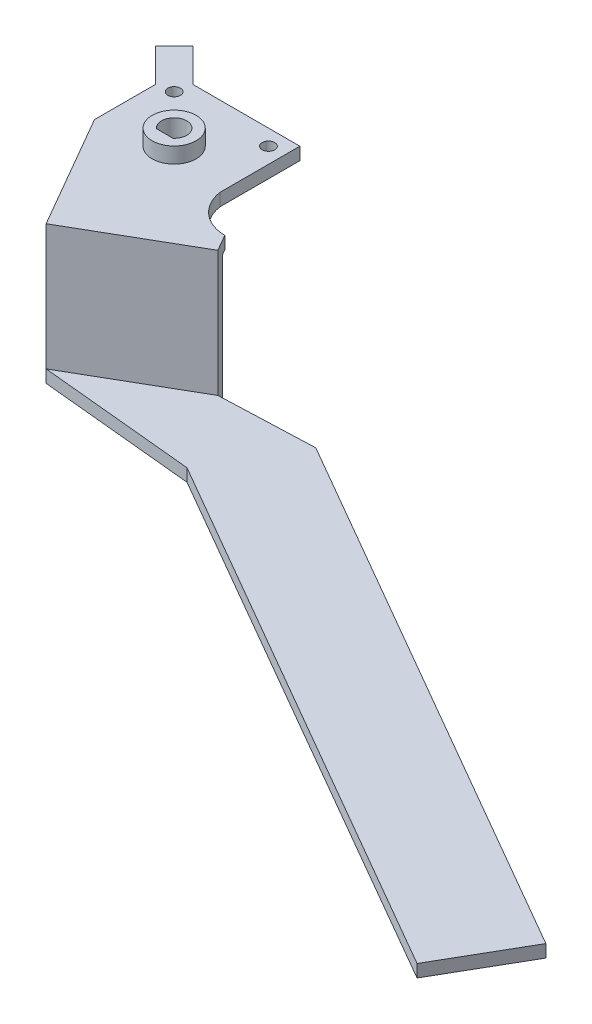
ISO-10303-21;
HEADER;
FILE_DESCRIPTION(('STEP AP214'),'2;1');
FILE_NAME('part.step','',(''),(''),'','','');
FILE_SCHEMA(('AUTOMOTIVE_DESIGN { 1 0 10303 214 1 1 1 1 }'));
ENDSEC;
DATA;
#1=APPLICATION_CONTEXT('core data for automotive mechanical design processes');
#2=APPLICATION_PROTOCOL_DEFINITION('international standard','automotive_design',2000,#1);
#3=PRODUCT_CONTEXT('',#1,'mechanical');
#4=PRODUCT('Part','Part','',(#3));
#5=PRODUCT_RELATED_PRODUCT_CATEGORY('part','',(#4));
#6=PRODUCT_DEFINITION_FORMATION('','',#4);
#7=PRODUCT_DEFINITION_CONTEXT('part definition',#1,'design');
#8=PRODUCT_DEFINITION('design','',#6,#7);
#9=PRODUCT_DEFINITION_SHAPE('','',#8);
#10=(LENGTH_UNIT() NAMED_UNIT(*) SI_UNIT(.MILLI.,.METRE.));
#11=(NAMED_UNIT(*) PLANE_ANGLE_UNIT() SI_UNIT($,.RADIAN.));
#12=(NAMED_UNIT(*) SI_UNIT($,.STERADIAN.) SOLID_ANGLE_UNIT());
#13=UNCERTAINTY_MEASURE_WITH_UNIT(LENGTH_MEASURE(1.E-05),#10,'distance_accuracy_value','');
#14=(GEOMETRIC_REPRESENTATION_CONTEXT(3) GLOBAL_UNCERTAINTY_ASSIGNED_CONTEXT((#13)) GLOBAL_UNIT_ASSIGNED_CONTEXT((#10,
#11,#12)) REPRESENTATION_CONTEXT('',''));
#15=CARTESIAN_POINT('',(0.,0.,0.));
#16=DIRECTION('',(0.,0.,1.));
#17=DIRECTION('',(1.,0.,0.));
#18=AXIS2_PLACEMENT_3D('',#15,#16,#17);
#19=CARTESIAN_POINT('',(32.8718229662952,0.,3.53794746118881));
#20=DIRECTION('',(0.,1.,0.));
#21=DIRECTION('',(0.,0.,1.));
#22=AXIS2_PLACEMENT_3D('',#19,#20,#21);
#23=PLANE('',#22);
#24=CARTESIAN_POINT('',(0.,0.,0.));
#25=DIRECTION('',(0.,1.,0.));
#26=DIRECTION('',(0.,0.,-1.));
#27=AXIS2_PLACEMENT_3D('',#24,#25,#26);
#28=CIRCLE('',#27,4.);
#29=CARTESIAN_POINT('',(2.64575131106459,0.,3.));
#30=VERTEX_POINT('',#29);
#31=CARTESIAN_POINT('',(-2.64575131106459,0.,3.));
#32=VERTEX_POINT('',#31);
#33=EDGE_CURVE('E55',#30,#32,#28,.T.);
#34=ORIENTED_EDGE('',*,*,#33,.T.);
#35=DIRECTION('',(1.,0.,0.));
#36=VECTOR('',#35,1.);
#37=CARTESIAN_POINT('',(-2.64575131106459,0.,3.));
#38=LINE('',#37,#36);
#39=EDGE_CURVE('E243',#32,#30,#38,.T.);
#40=ORIENTED_EDGE('',*,*,#39,.T.);
#41=EDGE_LOOP('',(#34,#40));
#42=FACE_BOUND('',#41,.T.);
#43=CARTESIAN_POINT('',(-15.,0.,-15.));
#44=DIRECTION('',(0.,1.,0.));
#45=DIRECTION('',(0.,0.,1.));
#46=AXIS2_PLACEMENT_3D('',#43,#44,#45);
#47=CIRCLE('',#46,2.);
#48=CARTESIAN_POINT('',(-15.,0.,-13.));
#49=VERTEX_POINT('',#48);
#50=EDGE_CURVE('E254',#49,#49,#47,.T.);
#51=ORIENTED_EDGE('',*,*,#50,.T.);
#52=EDGE_LOOP('',(#51));
#53=FACE_BOUND('',#52,.T.);
#54=CARTESIAN_POINT('',(15.,0.,-15.));
#55=DIRECTION('',(0.,1.,0.));
#56=DIRECTION('',(0.,0.,1.));
#57=AXIS2_PLACEMENT_3D('',#54,#55,#56);
#58=CIRCLE('',#57,2.00000000000001);
#59=CARTESIAN_POINT('',(15.,0.,-13.));
#60=VERTEX_POINT('',#59);
#61=EDGE_CURVE('E250',#60,#60,#58,.T.);
#62=ORIENTED_EDGE('',*,*,#61,.T.);
#63=EDGE_LOOP('',(#62));
#64=FACE_BOUND('',#63,.T.);
#65=DIRECTION('',(0.866025403784439,0.,-0.5));
#66=VECTOR('',#65,1.);
#67=CARTESIAN_POINT('',(33.6410161513782,0.,18.2679491924316));
#68=LINE('',#67,#66);
#69=CARTESIAN_POINT('',(-0.999999999999408,0.,38.2679491924316));
#70=VERTEX_POINT('',#69);
#71=CARTESIAN_POINT('',(33.6410161513782,0.,18.2679491924316));
#72=VERTEX_POINT('',#71);
#73=EDGE_CURVE('E47',#70,#72,#68,.T.);
#74=ORIENTED_EDGE('',*,*,#73,.F.);
#75=DIRECTION('',(0.500000000000005,0.,0.866025403784435));
#76=VECTOR('',#75,1.);
#77=CARTESIAN_POINT('',(0.99999999999973,0.,41.7320508075678));
#78=LINE('',#77,#76);
#79=CARTESIAN_POINT('',(-20.0000000000002,0.,5.35898384862204));
#80=VERTEX_POINT('',#79);
#81=EDGE_CURVE('E296',#80,#70,#78,.T.);
#82=ORIENTED_EDGE('',*,*,#81,.F.);
#83=DIRECTION('',(0.,0.,1.));
#84=VECTOR('',#83,1.);
#85=CARTESIAN_POINT('',(-20.,0.,-14.));
#86=LINE('',#85,#84);
#87=CARTESIAN_POINT('',(-20.,0.,-14.));
#88=VERTEX_POINT('',#87);
#89=EDGE_CURVE('E294',#88,#80,#86,.T.);
#90=ORIENTED_EDGE('',*,*,#89,.F.);
#91=DIRECTION('',(0.707106781186547,0.,0.707106781186547));
#92=VECTOR('',#91,1.);
#93=CARTESIAN_POINT('',(-30.6066017177982,0.,-24.6066017177982));
#94=LINE('',#93,#92);
#95=CARTESIAN_POINT('',(-30.6066017177982,0.,-24.6066017177982));
#96=VERTEX_POINT('',#95);
#97=EDGE_CURVE('E292',#96,#88,#94,.T.);
#98=ORIENTED_EDGE('',*,*,#97,.F.);
#99=DIRECTION('',(-0.707106781186548,0.,0.707106781186547));
#100=VECTOR('',#99,1.);
#101=CARTESIAN_POINT('',(-24.6066017177982,0.,-30.6066017177982));
#102=LINE('',#101,#100);
#103=CARTESIAN_POINT('',(-24.6066017177982,0.,-30.6066017177982));
#104=VERTEX_POINT('',#103);
#105=EDGE_CURVE('E290',#104,#96,#102,.T.);
#106=ORIENTED_EDGE('',*,*,#105,.F.);
#107=DIRECTION('',(-0.707106781186548,0.,-0.707106781186547));
#108=VECTOR('',#107,1.);
#109=CARTESIAN_POINT('',(-14.,0.,-20.));
#110=LINE('',#109,#108);
#111=CARTESIAN_POINT('',(-14.,0.,-20.));
#112=VERTEX_POINT('',#111);
#113=EDGE_CURVE('E288',#112,#104,#110,.T.);
#114=ORIENTED_EDGE('',*,*,#113,.F.);
#115=DIRECTION('',(-1.,0.,0.));
#116=VECTOR('',#115,1.);
#117=CARTESIAN_POINT('',(-14.,0.,-20.));
#118=LINE('',#117,#116);
#119=CARTESIAN_POINT('',(20.,0.,-20.));
#120=VERTEX_POINT('',#119);
#121=EDGE_CURVE('E260',#120,#112,#118,.T.);
#122=ORIENTED_EDGE('',*,*,#121,.F.);
#123=DIRECTION('',(0.,0.,-1.));
#124=VECTOR('',#123,1.);
#125=CARTESIAN_POINT('',(20.,0.,-20.));
#126=LINE('',#125,#124);
#127=CARTESIAN_POINT('',(20.,0.,5.35898384862204));
#128=VERTEX_POINT('',#127);
#129=EDGE_CURVE('E267',#128,#120,#126,.T.);
#130=ORIENTED_EDGE('',*,*,#129,.F.);
#131=CARTESIAN_POINT('',(32.8718229662952,0.,3.53794746118881));
#132=DIRECTION('',(0.,-1.,0.));
#133=DIRECTION('',(0.,0.,1.));
#134=AXIS2_PLACEMENT_3D('',#131,#132,#133);
#135=CIRCLE('',#134,13.);
#136=CARTESIAN_POINT('',(32.6410161513771,0.,16.5358983848609));
#137=VERTEX_POINT('',#136);
#138=EDGE_CURVE('E300',#137,#128,#135,.T.);
#139=ORIENTED_EDGE('',*,*,#138,.F.);
#140=DIRECTION('',(-0.500000000000001,0.,-0.866025403784438));
#141=VECTOR('',#140,1.);
#142=CARTESIAN_POINT('',(35.6410161513771,0.,21.7320508075675));
#143=LINE('',#142,#141);
#144=EDGE_CURVE('E298',#72,#137,#143,.T.);
#145=ORIENTED_EDGE('',*,*,#144,.F.);
#146=EDGE_LOOP('',(#74,#82,#90,#98,#106,#114,#122,#130,#139,#145));
#147=FACE_BOUND('',#146,.T.);
#148=ADVANCED_FACE('F32',(#42,#53,#64,#147),#23,.F.);
#149=CARTESIAN_POINT('',(32.8718229662952,4.,3.53794746118881));
#150=DIRECTION('',(0.,1.,0.));
#151=DIRECTION('',(0.,0.,1.));
#152=AXIS2_PLACEMENT_3D('',#149,#150,#151);
#153=PLANE('',#152);
#154=CARTESIAN_POINT('',(15.,4.,-15.));
#155=DIRECTION('',(0.,1.,0.));
#156=DIRECTION('',(0.,0.,1.));
#157=AXIS2_PLACEMENT_3D('',#154,#155,#156);
#158=CIRCLE('',#157,2.00000000000001);
#159=CARTESIAN_POINT('',(15.,4.,-13.));
#160=VERTEX_POINT('',#159);
#161=EDGE_CURVE('E251',#160,#160,#158,.T.);
#162=ORIENTED_EDGE('',*,*,#161,.F.);
#163=EDGE_LOOP('',(#162));
#164=FACE_BOUND('',#163,.T.);
#165=DIRECTION('',(-1.,0.,0.));
#166=VECTOR('',#165,1.);
#167=CARTESIAN_POINT('',(-14.,4.,-20.));
#168=LINE('',#167,#166);
#169=CARTESIAN_POINT('',(20.,4.,-20.));
#170=VERTEX_POINT('',#169);
#171=CARTESIAN_POINT('',(-14.,4.,-20.));
#172=VERTEX_POINT('',#171);
#173=EDGE_CURVE('E263',#170,#172,#168,.T.);
#174=ORIENTED_EDGE('',*,*,#173,.T.);
#175=DIRECTION('',(-0.707106781186548,0.,-0.707106781186547));
#176=VECTOR('',#175,1.);
#177=CARTESIAN_POINT('',(-14.,4.,-20.));
#178=LINE('',#177,#176);
#179=CARTESIAN_POINT('',(-24.6066017177982,4.,-30.6066017177982));
#180=VERTEX_POINT('',#179);
#181=EDGE_CURVE('E266',#172,#180,#178,.T.);
#182=ORIENTED_EDGE('',*,*,#181,.T.);
#183=DIRECTION('',(-0.707106781186548,0.,0.707106781186547));
#184=VECTOR('',#183,1.);
#185=CARTESIAN_POINT('',(-24.6066017177982,4.,-30.6066017177982));
#186=LINE('',#185,#184);
#187=CARTESIAN_POINT('',(-30.6066017177982,4.,-24.6066017177982));
#188=VERTEX_POINT('',#187);
#189=EDGE_CURVE('E269',#180,#188,#186,.T.);
#190=ORIENTED_EDGE('',*,*,#189,.T.);
#191=DIRECTION('',(0.707106781186547,0.,0.707106781186547));
#192=VECTOR('',#191,1.);
#193=CARTESIAN_POINT('',(-30.6066017177982,4.,-24.6066017177982));
#194=LINE('',#193,#192);
#195=CARTESIAN_POINT('',(-20.,4.,-14.));
#196=VERTEX_POINT('',#195);
#197=EDGE_CURVE('E271',#188,#196,#194,.T.);
#198=ORIENTED_EDGE('',*,*,#197,.T.);
#199=DIRECTION('',(0.,0.,1.));
#200=VECTOR('',#199,1.);
#201=CARTESIAN_POINT('',(-20.,4.,-14.));
#202=LINE('',#201,#200);
#203=CARTESIAN_POINT('',(-20.0000000000002,4.,5.35898384862204));
#204=VERTEX_POINT('',#203);
#205=EDGE_CURVE('E273',#196,#204,#202,.T.);
#206=ORIENTED_EDGE('',*,*,#205,.T.);
#207=DIRECTION('',(0.500000000000005,0.,0.866025403784435));
#208=VECTOR('',#207,1.);
#209=CARTESIAN_POINT('',(0.99999999999973,4.,41.7320508075678));
#210=LINE('',#209,#208);
#211=CARTESIAN_POINT('',(0.99999999999973,4.,41.7320508075678));
#212=VERTEX_POINT('',#211);
#213=EDGE_CURVE('E275',#204,#212,#210,.T.);
#214=ORIENTED_EDGE('',*,*,#213,.T.);
#215=DIRECTION('',(0.866025403784434,0.,-0.500000000000007));
#216=VECTOR('',#215,1.);
#217=CARTESIAN_POINT('',(0.99999999999973,4.,41.7320508075678));
#218=LINE('',#217,#216);
#219=CARTESIAN_POINT('',(35.6410161513771,4.,21.7320508075675));
#220=VERTEX_POINT('',#219);
#221=EDGE_CURVE('E277',#212,#220,#218,.T.);
#222=ORIENTED_EDGE('',*,*,#221,.T.);
#223=DIRECTION('',(-0.500000000000001,0.,-0.866025403784438));
#224=VECTOR('',#223,1.);
#225=CARTESIAN_POINT('',(35.6410161513771,4.,21.7320508075675));
#226=LINE('',#225,#224);
#227=CARTESIAN_POINT('',(32.6410161513771,4.,16.5358983848609));
#228=VERTEX_POINT('',#227);
#229=EDGE_CURVE('E279',#220,#228,#226,.T.);
#230=ORIENTED_EDGE('',*,*,#229,.T.);
#231=CARTESIAN_POINT('',(32.8718229662952,4.,3.53794746118881));
#232=DIRECTION('',(0.,-1.,0.));
#233=DIRECTION('',(0.,0.,1.));
#234=AXIS2_PLACEMENT_3D('',#231,#232,#233);
#235=CIRCLE('',#234,13.);
#236=CARTESIAN_POINT('',(20.,4.,5.35898384862204));
#237=VERTEX_POINT('',#236);
#238=EDGE_CURVE('E281',#228,#237,#235,.T.);
#239=ORIENTED_EDGE('',*,*,#238,.T.);
#240=DIRECTION('',(0.,0.,-1.));
#241=VECTOR('',#240,1.);
#242=CARTESIAN_POINT('',(20.,4.,-20.));
#243=LINE('',#242,#241);
#244=EDGE_CURVE('E283',#237,#170,#243,.T.);
#245=ORIENTED_EDGE('',*,*,#244,.T.);
#246=EDGE_LOOP('',(#174,#182,#190,#198,#206,#214,#222,#230,#239,#245));
#247=FACE_BOUND('',#246,.T.);
#248=CARTESIAN_POINT('',(-15.,4.,-15.));
#249=DIRECTION('',(0.,1.,0.));
#250=DIRECTION('',(0.,0.,1.));
#251=AXIS2_PLACEMENT_3D('',#248,#249,#250);
#252=CIRCLE('',#251,2.);
#253=CARTESIAN_POINT('',(-15.,4.,-13.));
#254=VERTEX_POINT('',#253);
#255=EDGE_CURVE('E257',#254,#254,#252,.T.);
#256=ORIENTED_EDGE('',*,*,#255,.F.);
#257=EDGE_LOOP('',(#256));
#258=FACE_BOUND('',#257,.T.);
#259=CARTESIAN_POINT('',(0.,4.,0.));
#260=DIRECTION('',(0.,1.,0.));
#261=DIRECTION('',(0.,0.,1.));
#262=AXIS2_PLACEMENT_3D('',#259,#260,#261);
#263=CIRCLE('',#262,7.);
#264=CARTESIAN_POINT('',(0.,4.,7.));
#265=VERTEX_POINT('',#264);
#266=EDGE_CURVE('E236',#265,#265,#263,.T.);
#267=ORIENTED_EDGE('',*,*,#266,.F.);
#268=EDGE_LOOP('',(#267));
#269=FACE_BOUND('',#268,.T.);
#270=ADVANCED_FACE('F346',(#164,#247,#258,#269),#153,.T.);
#271=CARTESIAN_POINT('',(-14.,4.,-20.));
#272=DIRECTION('',(0.,0.,1.));
#273=DIRECTION('',(1.,0.,0.));
#274=AXIS2_PLACEMENT_3D('',#271,#272,#273);
#275=PLANE('',#274);
#276=ORIENTED_EDGE('',*,*,#121,.T.);
#277=DIRECTION('',(0.,-1.,0.));
#278=VECTOR('',#277,1.);
#279=CARTESIAN_POINT('',(-14.,4.,-20.));
#280=LINE('',#279,#278);
#281=EDGE_CURVE('E11',#172,#112,#280,.T.);
#282=ORIENTED_EDGE('',*,*,#281,.F.);
#283=ORIENTED_EDGE('',*,*,#173,.F.);
#284=DIRECTION('',(0.,-1.,0.));
#285=VECTOR('',#284,1.);
#286=CARTESIAN_POINT('',(20.,4.,-20.));
#287=LINE('',#286,#285);
#288=EDGE_CURVE('E285',#170,#120,#287,.T.);
#289=ORIENTED_EDGE('',*,*,#288,.T.);
#290=EDGE_LOOP('',(#276,#282,#283,#289));
#291=FACE_BOUND('',#290,.T.);
#292=ADVANCED_FACE('F34',(#291),#275,.F.);
#293=CARTESIAN_POINT('',(-14.,4.,-20.));
#294=DIRECTION('',(-0.707106781186547,0.,0.707106781186548));
#295=DIRECTION('',(0.707106781186548,0.,0.707106781186547));
#296=AXIS2_PLACEMENT_3D('',#293,#294,#295);
#297=PLANE('',#296);
#298=ORIENTED_EDGE('',*,*,#113,.T.);
#299=DIRECTION('',(0.,-1.,0.));
#300=VECTOR('',#299,1.);
#301=CARTESIAN_POINT('',(-24.6066017177982,4.,-30.6066017177982));
#302=LINE('',#301,#300);
#303=EDGE_CURVE('E40',#180,#104,#302,.T.);
#304=ORIENTED_EDGE('',*,*,#303,.F.);
#305=ORIENTED_EDGE('',*,*,#181,.F.);
#306=ORIENTED_EDGE('',*,*,#281,.T.);
#307=EDGE_LOOP('',(#298,#304,#305,#306));
#308=FACE_BOUND('',#307,.T.);
#309=ADVANCED_FACE('F351',(#308),#297,.F.);
#310=CARTESIAN_POINT('',(-24.6066017177982,4.,-30.6066017177982));
#311=DIRECTION('',(0.707106781186547,0.,0.707106781186548));
#312=DIRECTION('',(0.707106781186548,0.,-0.707106781186547));
#313=AXIS2_PLACEMENT_3D('',#310,#311,#312);
#314=PLANE('',#313);
#315=ORIENTED_EDGE('',*,*,#105,.T.);
#316=DIRECTION('',(0.,-1.,0.));
#317=VECTOR('',#316,1.);
#318=CARTESIAN_POINT('',(-30.6066017177982,4.,-24.6066017177982));
#319=LINE('',#318,#317);
#320=EDGE_CURVE('E323',#188,#96,#319,.T.);
#321=ORIENTED_EDGE('',*,*,#320,.F.);
#322=ORIENTED_EDGE('',*,*,#189,.F.);
#323=ORIENTED_EDGE('',*,*,#303,.T.);
#324=EDGE_LOOP('',(#315,#321,#322,#323));
#325=FACE_BOUND('',#324,.T.);
#326=ADVANCED_FACE('F330',(#325),#314,.F.);
#327=CARTESIAN_POINT('',(-30.6066017177982,4.,-24.6066017177982));
#328=DIRECTION('',(0.707106781186548,0.,-0.707106781186548));
#329=DIRECTION('',(-0.707106781186547,0.,-0.707106781186548));
#330=AXIS2_PLACEMENT_3D('',#327,#328,#329);
#331=PLANE('',#330);
#332=ORIENTED_EDGE('',*,*,#97,.T.);
#333=DIRECTION('',(0.,-1.,0.));
#334=VECTOR('',#333,1.);
#335=CARTESIAN_POINT('',(-20.,4.,-14.));
#336=LINE('',#335,#334);
#337=EDGE_CURVE('E320',#196,#88,#336,.T.);
#338=ORIENTED_EDGE('',*,*,#337,.F.);
#339=ORIENTED_EDGE('',*,*,#197,.F.);
#340=ORIENTED_EDGE('',*,*,#320,.T.);
#341=EDGE_LOOP('',(#332,#338,#339,#340));
#342=FACE_BOUND('',#341,.T.);
#343=ADVANCED_FACE('F338',(#342),#331,.F.);
#344=CARTESIAN_POINT('',(-20.,4.,-14.));
#345=DIRECTION('',(1.,0.,0.));
#346=DIRECTION('',(0.,0.,-1.));
#347=AXIS2_PLACEMENT_3D('',#344,#345,#346);
#348=PLANE('',#347);
#349=ORIENTED_EDGE('',*,*,#89,.T.);
#350=DIRECTION('',(0.,-1.,0.));
#351=VECTOR('',#350,1.);
#352=CARTESIAN_POINT('',(-20.0000000000002,4.,5.35898384862204));
#353=LINE('',#352,#351);
#354=EDGE_CURVE('E317',#204,#80,#353,.T.);
#355=ORIENTED_EDGE('',*,*,#354,.F.);
#356=ORIENTED_EDGE('',*,*,#205,.F.);
#357=ORIENTED_EDGE('',*,*,#337,.T.);
#358=EDGE_LOOP('',(#349,#355,#356,#357));
#359=FACE_BOUND('',#358,.T.);
#360=ADVANCED_FACE('F342',(#359),#348,.F.);
#361=CARTESIAN_POINT('',(0.99999999999973,4.,41.7320508075678));
#362=DIRECTION('',(0.866025403784436,0.,-0.500000000000005));
#363=DIRECTION('',(-0.500000000000005,0.,-0.866025403784436));
#364=AXIS2_PLACEMENT_3D('',#361,#362,#363);
#365=PLANE('',#364);
#366=ORIENTED_EDGE('',*,*,#81,.T.);
#367=DIRECTION('',(0.,1.,0.));
#368=VECTOR('',#367,1.);
#369=CARTESIAN_POINT('',(-0.999999999999397,-40.,38.2679491924316));
#370=LINE('',#369,#368);
#371=CARTESIAN_POINT('',(-0.999999999999397,-40.,38.2679491924316));
#372=VERTEX_POINT('',#371);
#373=EDGE_CURVE('E227',#372,#70,#370,.T.);
#374=ORIENTED_EDGE('',*,*,#373,.F.);
#375=DIRECTION('',(-0.500000000000002,0.,-0.866025403784437));
#376=VECTOR('',#375,1.);
#377=CARTESIAN_POINT('',(-0.999999999999397,-40.,38.2679491924316));
#378=LINE('',#377,#376);
#379=CARTESIAN_POINT('',(1.00000000000078,-40.,41.7320508075696));
#380=VERTEX_POINT('',#379);
#381=EDGE_CURVE('E216',#380,#372,#378,.T.);
#382=ORIENTED_EDGE('',*,*,#381,.F.);
#383=DIRECTION('',(0.,-1.,0.));
#384=VECTOR('',#383,1.);
#385=CARTESIAN_POINT('',(0.99999999999973,-36.,41.7320508075678));
#386=LINE('',#385,#384);
#387=CARTESIAN_POINT('',(0.99999999999973,-36.,41.7320508075678));
#388=VERTEX_POINT('',#387);
#389=EDGE_CURVE('E208',#388,#380,#386,.T.);
#390=ORIENTED_EDGE('',*,*,#389,.F.);
#391=DIRECTION('',(0.,-1.,0.));
#392=VECTOR('',#391,1.);
#393=CARTESIAN_POINT('',(0.99999999999973,4.,41.7320508075678));
#394=LINE('',#393,#392);
#395=EDGE_CURVE('E314',#212,#388,#394,.T.);
#396=ORIENTED_EDGE('',*,*,#395,.F.);
#397=ORIENTED_EDGE('',*,*,#213,.F.);
#398=ORIENTED_EDGE('',*,*,#354,.T.);
#399=EDGE_LOOP('',(#366,#374,#382,#390,#396,#397,#398));
#400=FACE_BOUND('',#399,.T.);
#401=ADVANCED_FACE('F374',(#400),#365,.F.);
#402=CARTESIAN_POINT('',(0.99999999999973,4.,41.7320508075678));
#403=DIRECTION('',(-0.500000000000007,0.,-0.866025403784434));
#404=DIRECTION('',(-0.866025403784434,0.,0.500000000000007));
#405=AXIS2_PLACEMENT_3D('',#402,#403,#404);
#406=PLANE('',#405);
#407=ORIENTED_EDGE('',*,*,#395,.T.);
#408=DIRECTION('',(0.866025403784434,0.,-0.500000000000007));
#409=VECTOR('',#408,1.);
#410=CARTESIAN_POINT('',(0.99999999999973,-36.,41.7320508075678));
#411=LINE('',#410,#409);
#412=CARTESIAN_POINT('',(35.6410161513771,-36.,21.7320508075675));
#413=VERTEX_POINT('',#412);
#414=EDGE_CURVE('E198',#388,#413,#411,.T.);
#415=ORIENTED_EDGE('',*,*,#414,.T.);
#416=DIRECTION('',(0.,-1.,0.));
#417=VECTOR('',#416,1.);
#418=CARTESIAN_POINT('',(35.6410161513771,4.,21.7320508075675));
#419=LINE('',#418,#417);
#420=EDGE_CURVE('E311',#220,#413,#419,.T.);
#421=ORIENTED_EDGE('',*,*,#420,.F.);
#422=ORIENTED_EDGE('',*,*,#221,.F.);
#423=EDGE_LOOP('',(#407,#415,#421,#422));
#424=FACE_BOUND('',#423,.T.);
#425=ADVANCED_FACE('F379',(#424),#406,.F.);
#426=CARTESIAN_POINT('',(35.6410161513771,4.,21.7320508075675));
#427=DIRECTION('',(-0.866025403784438,0.,0.500000000000001));
#428=DIRECTION('',(0.500000000000001,0.,0.866025403784438));
#429=AXIS2_PLACEMENT_3D('',#426,#427,#428);
#430=PLANE('',#429);
#431=ORIENTED_EDGE('',*,*,#420,.T.);
#432=DIRECTION('',(0.,-1.,0.));
#433=VECTOR('',#432,1.);
#434=CARTESIAN_POINT('',(35.6410161513771,-36.,21.7320508075675));
#435=LINE('',#434,#433);
#436=CARTESIAN_POINT('',(35.6410161513771,-40.,21.7320508075675));
#437=VERTEX_POINT('',#436);
#438=EDGE_CURVE('E205',#413,#437,#435,.T.);
#439=ORIENTED_EDGE('',*,*,#438,.T.);
#440=DIRECTION('',(0.500000000000002,0.,0.866025403784437));
#441=VECTOR('',#440,1.);
#442=CARTESIAN_POINT('',(35.6410161513782,-40.,21.7320508075693));
#443=LINE('',#442,#441);
#444=CARTESIAN_POINT('',(33.6410161513782,-40.,18.2679491924316));
#445=VERTEX_POINT('',#444);
#446=EDGE_CURVE('E220',#445,#437,#443,.T.);
#447=ORIENTED_EDGE('',*,*,#446,.F.);
#448=DIRECTION('',(0.,1.,0.));
#449=VECTOR('',#448,1.);
#450=CARTESIAN_POINT('',(33.6410161513782,-40.,18.2679491924316));
#451=LINE('',#450,#449);
#452=EDGE_CURVE('E223',#445,#72,#451,.T.);
#453=ORIENTED_EDGE('',*,*,#452,.T.);
#454=ORIENTED_EDGE('',*,*,#144,.T.);
#455=DIRECTION('',(0.,-1.,0.));
#456=VECTOR('',#455,1.);
#457=CARTESIAN_POINT('',(32.6410161513771,4.,16.5358983848609));
#458=LINE('',#457,#456);
#459=EDGE_CURVE('E308',#228,#137,#458,.T.);
#460=ORIENTED_EDGE('',*,*,#459,.F.);
#461=ORIENTED_EDGE('',*,*,#229,.F.);
#462=EDGE_LOOP('',(#431,#439,#447,#453,#454,#460,#461));
#463=FACE_BOUND('',#462,.T.);
#464=ADVANCED_FACE('F366',(#463),#430,.F.);
#465=CARTESIAN_POINT('',(32.8718229662952,4.,3.53794746118881));
#466=DIRECTION('',(0.,-1.,0.));
#467=DIRECTION('',(0.,0.,-1.));
#468=AXIS2_PLACEMENT_3D('',#465,#466,#467);
#469=CYLINDRICAL_SURFACE('',#468,13.);
#470=ORIENTED_EDGE('',*,*,#138,.T.);
#471=DIRECTION('',(0.,-1.,0.));
#472=VECTOR('',#471,1.);
#473=CARTESIAN_POINT('',(20.,4.,5.35898384862204));
#474=LINE('',#473,#472);
#475=EDGE_CURVE('E305',#237,#128,#474,.T.);
#476=ORIENTED_EDGE('',*,*,#475,.F.);
#477=ORIENTED_EDGE('',*,*,#238,.F.);
#478=ORIENTED_EDGE('',*,*,#459,.T.);
#479=EDGE_LOOP('',(#470,#476,#477,#478));
#480=FACE_BOUND('',#479,.T.);
#481=ADVANCED_FACE('F362',(#480),#469,.F.);
#482=CARTESIAN_POINT('',(20.,4.,-20.));
#483=DIRECTION('',(-1.,0.,0.));
#484=DIRECTION('',(0.,0.,1.));
#485=AXIS2_PLACEMENT_3D('',#482,#483,#484);
#486=PLANE('',#485);
#487=ORIENTED_EDGE('',*,*,#129,.T.);
#488=ORIENTED_EDGE('',*,*,#288,.F.);
#489=ORIENTED_EDGE('',*,*,#244,.F.);
#490=ORIENTED_EDGE('',*,*,#475,.T.);
#491=EDGE_LOOP('',(#487,#488,#489,#490));
#492=FACE_BOUND('',#491,.T.);
#493=ADVANCED_FACE('F357',(#492),#486,.F.);
#494=CARTESIAN_POINT('',(-15.,4.,-15.));
#495=DIRECTION('',(0.,-1.,0.));
#496=DIRECTION('',(0.,0.,-1.));
#497=AXIS2_PLACEMENT_3D('',#494,#495,#496);
#498=CYLINDRICAL_SURFACE('',#497,2.);
#499=ORIENTED_EDGE('',*,*,#255,.T.);
#500=EDGE_LOOP('',(#499));
#501=FACE_BOUND('',#500,.T.);
#502=ORIENTED_EDGE('',*,*,#50,.F.);
#503=EDGE_LOOP('',(#502));
#504=FACE_BOUND('',#503,.T.);
#505=ADVANCED_FACE('F419',(#501,#504),#498,.F.);
#506=CARTESIAN_POINT('',(15.,4.,-15.));
#507=DIRECTION('',(0.,-1.,0.));
#508=DIRECTION('',(0.,0.,-1.));
#509=AXIS2_PLACEMENT_3D('',#506,#507,#508);
#510=CYLINDRICAL_SURFACE('',#509,2.00000000000001);
#511=ORIENTED_EDGE('',*,*,#161,.T.);
#512=EDGE_LOOP('',(#511));
#513=FACE_BOUND('',#512,.T.);
#514=ORIENTED_EDGE('',*,*,#61,.F.);
#515=EDGE_LOOP('',(#514));
#516=FACE_BOUND('',#515,.T.);
#517=ADVANCED_FACE('F451',(#513,#516),#510,.F.);
#518=CARTESIAN_POINT('',(0.,4.,0.));
#519=DIRECTION('',(0.,-1.,0.));
#520=DIRECTION('',(0.,0.,-1.));
#521=AXIS2_PLACEMENT_3D('',#518,#519,#520);
#522=CYLINDRICAL_SURFACE('',#521,4.);
#523=ORIENTED_EDGE('',*,*,#33,.F.);
#524=DIRECTION('',(0.,-1.,0.));
#525=VECTOR('',#524,1.);
#526=CARTESIAN_POINT('',(2.64575131106459,4.,3.));
#527=LINE('',#526,#525);
#528=CARTESIAN_POINT('',(2.64575131106459,9.,3.));
#529=VERTEX_POINT('',#528);
#530=EDGE_CURVE('E246',#529,#30,#527,.T.);
#531=ORIENTED_EDGE('',*,*,#530,.F.);
#532=CARTESIAN_POINT('',(0.,9.,0.));
#533=DIRECTION('',(0.,1.,0.));
#534=DIRECTION('',(0.,0.,-1.));
#535=AXIS2_PLACEMENT_3D('',#532,#533,#534);
#536=CIRCLE('',#535,4.);
#537=CARTESIAN_POINT('',(-2.64575131106459,9.,3.));
#538=VERTEX_POINT('',#537);
#539=EDGE_CURVE('E230',#529,#538,#536,.T.);
#540=ORIENTED_EDGE('',*,*,#539,.T.);
#541=DIRECTION('',(0.,-1.,0.));
#542=VECTOR('',#541,1.);
#543=CARTESIAN_POINT('',(-2.64575131106459,4.,3.));
#544=LINE('',#543,#542);
#545=EDGE_CURVE('E248',#538,#32,#544,.T.);
#546=ORIENTED_EDGE('',*,*,#545,.T.);
#547=EDGE_LOOP('',(#523,#531,#540,#546));
#548=FACE_BOUND('',#547,.T.);
#549=ADVANCED_FACE('F456',(#548),#522,.F.);
#550=CARTESIAN_POINT('',(-2.64575131106459,4.,3.));
#551=DIRECTION('',(0.,0.,-1.));
#552=DIRECTION('',(-1.,0.,0.));
#553=AXIS2_PLACEMENT_3D('',#550,#551,#552);
#554=PLANE('',#553);
#555=ORIENTED_EDGE('',*,*,#39,.F.);
#556=ORIENTED_EDGE('',*,*,#545,.F.);
#557=DIRECTION('',(1.,0.,0.));
#558=VECTOR('',#557,1.);
#559=CARTESIAN_POINT('',(-2.64575131106459,9.,3.));
#560=LINE('',#559,#558);
#561=EDGE_CURVE('E233',#538,#529,#560,.T.);
#562=ORIENTED_EDGE('',*,*,#561,.T.);
#563=ORIENTED_EDGE('',*,*,#530,.T.);
#564=EDGE_LOOP('',(#555,#556,#562,#563));
#565=FACE_BOUND('',#564,.T.);
#566=ADVANCED_FACE('F460',(#565),#554,.T.);
#567=CARTESIAN_POINT('',(0.,9.,0.));
#568=DIRECTION('',(0.,1.,0.));
#569=DIRECTION('',(0.,0.,1.));
#570=AXIS2_PLACEMENT_3D('',#567,#568,#569);
#571=PLANE('',#570);
#572=CARTESIAN_POINT('',(0.,9.,0.));
#573=DIRECTION('',(0.,1.,0.));
#574=DIRECTION('',(0.,0.,1.));
#575=AXIS2_PLACEMENT_3D('',#572,#573,#574);
#576=CIRCLE('',#575,7.);
#577=CARTESIAN_POINT('',(0.,9.,7.));
#578=VERTEX_POINT('',#577);
#579=EDGE_CURVE('E237',#578,#578,#576,.T.);
#580=ORIENTED_EDGE('',*,*,#579,.T.);
#581=EDGE_LOOP('',(#580));
#582=FACE_BOUND('',#581,.T.);
#583=ORIENTED_EDGE('',*,*,#561,.F.);
#584=ORIENTED_EDGE('',*,*,#539,.F.);
#585=EDGE_LOOP('',(#583,#584));
#586=FACE_BOUND('',#585,.T.);
#587=ADVANCED_FACE('F470',(#582,#586),#571,.T.);
#588=CARTESIAN_POINT('',(0.,9.,0.));
#589=DIRECTION('',(0.,-1.,0.));
#590=DIRECTION('',(0.,0.,-1.));
#591=AXIS2_PLACEMENT_3D('',#588,#589,#590);
#592=CYLINDRICAL_SURFACE('',#591,7.);
#593=ORIENTED_EDGE('',*,*,#579,.F.);
#594=EDGE_LOOP('',(#593));
#595=FACE_BOUND('',#594,.T.);
#596=ORIENTED_EDGE('',*,*,#266,.T.);
#597=EDGE_LOOP('',(#596));
#598=FACE_BOUND('',#597,.T.);
#599=ADVANCED_FACE('F480',(#595,#598),#592,.T.);
#600=CARTESIAN_POINT('',(33.6410161513782,-40.,18.2679491924316));
#601=DIRECTION('',(0.5,0.,0.866025403784439));
#602=DIRECTION('',(0.866025403784439,0.,-0.5));
#603=AXIS2_PLACEMENT_3D('',#600,#601,#602);
#604=PLANE('',#603);
#605=ORIENTED_EDGE('',*,*,#73,.T.);
#606=ORIENTED_EDGE('',*,*,#452,.F.);
#607=DIRECTION('',(0.866025403784439,0.,-0.5));
#608=VECTOR('',#607,1.);
#609=CARTESIAN_POINT('',(33.6410161513782,-40.,18.2679491924316));
#610=LINE('',#609,#608);
#611=EDGE_CURVE('E218',#372,#445,#610,.T.);
#612=ORIENTED_EDGE('',*,*,#611,.F.);
#613=ORIENTED_EDGE('',*,*,#373,.T.);
#614=EDGE_LOOP('',(#605,#606,#612,#613));
#615=FACE_BOUND('',#614,.T.);
#616=ADVANCED_FACE('F370',(#615),#604,.F.);
#617=CARTESIAN_POINT('',(0.,-40.,0.));
#618=DIRECTION('',(0.,1.,0.));
#619=DIRECTION('',(0.,0.,1.));
#620=AXIS2_PLACEMENT_3D('',#617,#618,#619);
#621=PLANE('',#620);
#622=ORIENTED_EDGE('',*,*,#381,.T.);
#623=ORIENTED_EDGE('',*,*,#611,.T.);
#624=ORIENTED_EDGE('',*,*,#446,.T.);
#625=DIRECTION('',(0.999260081289739,0.,-0.038461538461485));
#626=VECTOR('',#625,1.);
#627=CARTESIAN_POINT('',(65.6410161513771,-40.,20.5773502691899));
#628=LINE('',#627,#626);
#629=CARTESIAN_POINT('',(65.6410161513771,-40.,20.5773502691899));
#630=VERTEX_POINT('',#629);
#631=EDGE_CURVE('E190',#437,#630,#628,.T.);
#632=ORIENTED_EDGE('',*,*,#631,.T.);
#633=DIRECTION('',(-0.866025403784436,0.,-0.500000000000005));
#634=VECTOR('',#633,1.);
#635=CARTESIAN_POINT('',(238.846096908264,-40.,120.577350269191));
#636=LINE('',#635,#634);
#637=CARTESIAN_POINT('',(238.846096908264,-40.,120.577350269191));
#638=VERTEX_POINT('',#637);
#639=EDGE_CURVE('E174',#638,#630,#636,.T.);
#640=ORIENTED_EDGE('',*,*,#639,.F.);
#641=DIRECTION('',(0.500000000000005,0.,-0.866025403784436));
#642=VECTOR('',#641,1.);
#643=CARTESIAN_POINT('',(223.846096908264,-40.,146.558112382724));
#644=LINE('',#643,#642);
#645=CARTESIAN_POINT('',(223.846096908264,-40.,146.558112382724));
#646=VERTEX_POINT('',#645);
#647=EDGE_CURVE('E165',#646,#638,#644,.T.);
#648=ORIENTED_EDGE('',*,*,#647,.F.);
#649=DIRECTION('',(-0.866025403784436,0.,-0.500000000000005));
#650=VECTOR('',#649,1.);
#651=CARTESIAN_POINT('',(223.846096908264,-40.,146.558112382724));
#652=LINE('',#651,#650);
#653=CARTESIAN_POINT('',(50.641016151377,-40.,46.5581123827229));
#654=VERTEX_POINT('',#653);
#655=EDGE_CURVE('E170',#646,#654,#652,.T.);
#656=ORIENTED_EDGE('',*,*,#655,.T.);
#657=DIRECTION('',(-0.995307448193895,0.,-0.096763027907135));
#658=VECTOR('',#657,1.);
#659=CARTESIAN_POINT('',(50.641016151377,-40.,46.5581123827229));
#660=LINE('',#659,#658);
#661=EDGE_CURVE('E192',#654,#380,#660,.T.);
#662=ORIENTED_EDGE('',*,*,#661,.T.);
#663=EDGE_LOOP('',(#622,#623,#624,#632,#640,#648,#656,#662));
#664=FACE_BOUND('',#663,.T.);
#665=ADVANCED_FACE('F168',(#664),#621,.F.);
#666=CARTESIAN_POINT('',(50.641016151377,-36.,46.5581123827229));
#667=DIRECTION('',(-0.096763027907135,0.,0.995307448193895));
#668=DIRECTION('',(0.995307448193895,0.,0.096763027907135));
#669=AXIS2_PLACEMENT_3D('',#666,#667,#668);
#670=PLANE('',#669);
#671=ORIENTED_EDGE('',*,*,#661,.F.);
#672=DIRECTION('',(0.,-1.,0.));
#673=VECTOR('',#672,1.);
#674=CARTESIAN_POINT('',(50.641016151377,-36.,46.5581123827229));
#675=LINE('',#674,#673);
#676=CARTESIAN_POINT('',(50.641016151377,-36.,46.5581123827229));
#677=VERTEX_POINT('',#676);
#678=EDGE_CURVE('E189',#677,#654,#675,.T.);
#679=ORIENTED_EDGE('',*,*,#678,.F.);
#680=DIRECTION('',(-0.995307448193895,0.,-0.096763027907135));
#681=VECTOR('',#680,1.);
#682=CARTESIAN_POINT('',(50.641016151377,-36.,46.5581123827229));
#683=LINE('',#682,#681);
#684=EDGE_CURVE('E203',#677,#388,#683,.T.);
#685=ORIENTED_EDGE('',*,*,#684,.T.);
#686=ORIENTED_EDGE('',*,*,#389,.T.);
#687=EDGE_LOOP('',(#671,#679,#685,#686));
#688=FACE_BOUND('',#687,.T.);
#689=ADVANCED_FACE('F383',(#688),#670,.T.);
#690=CARTESIAN_POINT('',(65.6410161513771,-36.,20.5773502691899));
#691=DIRECTION('',(-0.038461538461485,0.,-0.999260081289739));
#692=DIRECTION('',(-0.999260081289739,0.,0.0384615384614851));
#693=AXIS2_PLACEMENT_3D('',#690,#691,#692);
#694=PLANE('',#693);
#695=ORIENTED_EDGE('',*,*,#631,.F.);
#696=ORIENTED_EDGE('',*,*,#438,.F.);
#697=DIRECTION('',(0.999260081289739,0.,-0.038461538461485));
#698=VECTOR('',#697,1.);
#699=CARTESIAN_POINT('',(65.6410161513771,-36.,20.5773502691899));
#700=LINE('',#699,#698);
#701=CARTESIAN_POINT('',(65.6410161513771,-36.,20.5773502691899));
#702=VERTEX_POINT('',#701);
#703=EDGE_CURVE('E201',#413,#702,#700,.T.);
#704=ORIENTED_EDGE('',*,*,#703,.T.);
#705=DIRECTION('',(0.,-1.,0.));
#706=VECTOR('',#705,1.);
#707=CARTESIAN_POINT('',(65.6410161513771,-36.,20.5773502691899));
#708=LINE('',#707,#706);
#709=EDGE_CURVE('E212',#702,#630,#708,.T.);
#710=ORIENTED_EDGE('',*,*,#709,.T.);
#711=EDGE_LOOP('',(#695,#696,#704,#710));
#712=FACE_BOUND('',#711,.T.);
#713=ADVANCED_FACE('F396',(#712),#694,.T.);
#714=CARTESIAN_POINT('',(0.,-36.,0.));
#715=DIRECTION('',(0.,1.,0.));
#716=DIRECTION('',(0.,0.,1.));
#717=AXIS2_PLACEMENT_3D('',#714,#715,#716);
#718=PLANE('',#717);
#719=ORIENTED_EDGE('',*,*,#414,.F.);
#720=ORIENTED_EDGE('',*,*,#684,.F.);
#721=DIRECTION('',(-0.866025403784436,0.,-0.500000000000005));
#722=VECTOR('',#721,1.);
#723=CARTESIAN_POINT('',(223.846096908264,-36.,146.558112382724));
#724=LINE('',#723,#722);
#725=CARTESIAN_POINT('',(223.846096908264,-36.,146.558112382724));
#726=VERTEX_POINT('',#725);
#727=EDGE_CURVE('E387',#726,#677,#724,.T.);
#728=ORIENTED_EDGE('',*,*,#727,.F.);
#729=DIRECTION('',(-0.500000000000005,0.,0.866025403784436));
#730=VECTOR('',#729,1.);
#731=CARTESIAN_POINT('',(223.846096908264,-36.,146.558112382724));
#732=LINE('',#731,#730);
#733=CARTESIAN_POINT('',(238.846096908264,-36.,120.577350269191));
#734=VERTEX_POINT('',#733);
#735=EDGE_CURVE('E183',#734,#726,#732,.T.);
#736=ORIENTED_EDGE('',*,*,#735,.F.);
#737=DIRECTION('',(-0.866025403784436,0.,-0.500000000000005));
#738=VECTOR('',#737,1.);
#739=CARTESIAN_POINT('',(238.846096908264,-36.,120.577350269191));
#740=LINE('',#739,#738);
#741=EDGE_CURVE('E194',#734,#702,#740,.T.);
#742=ORIENTED_EDGE('',*,*,#741,.T.);
#743=ORIENTED_EDGE('',*,*,#703,.F.);
#744=EDGE_LOOP('',(#719,#720,#728,#736,#742,#743));
#745=FACE_BOUND('',#744,.T.);
#746=ADVANCED_FACE('F386',(#745),#718,.T.);
#747=CARTESIAN_POINT('',(223.846096908264,-36.,146.558112382724));
#748=DIRECTION('',(0.500000000000005,0.,-0.866025403784436));
#749=DIRECTION('',(-0.866025403784436,0.,-0.500000000000005));
#750=AXIS2_PLACEMENT_3D('',#747,#748,#749);
#751=PLANE('',#750);
#752=ORIENTED_EDGE('',*,*,#678,.T.);
#753=ORIENTED_EDGE('',*,*,#655,.F.);
#754=DIRECTION('',(0.,-1.,0.));
#755=VECTOR('',#754,1.);
#756=CARTESIAN_POINT('',(223.846096908264,-36.,146.558112382724));
#757=LINE('',#756,#755);
#758=EDGE_CURVE('E178',#726,#646,#757,.T.);
#759=ORIENTED_EDGE('',*,*,#758,.F.);
#760=ORIENTED_EDGE('',*,*,#727,.T.);
#761=EDGE_LOOP('',(#752,#753,#759,#760));
#762=FACE_BOUND('',#761,.T.);
#763=ADVANCED_FACE('F188',(#762),#751,.F.);
#764=CARTESIAN_POINT('',(238.846096908264,-36.,120.577350269191));
#765=DIRECTION('',(-0.500000000000005,0.,0.866025403784436));
#766=DIRECTION('',(0.866025403784436,0.,0.500000000000005));
#767=AXIS2_PLACEMENT_3D('',#764,#765,#766);
#768=PLANE('',#767);
#769=ORIENTED_EDGE('',*,*,#709,.F.);
#770=ORIENTED_EDGE('',*,*,#741,.F.);
#771=DIRECTION('',(0.,1.,0.));
#772=VECTOR('',#771,1.);
#773=CARTESIAN_POINT('',(238.846096908264,-36.,120.577350269191));
#774=LINE('',#773,#772);
#775=EDGE_CURVE('E177',#638,#734,#774,.T.);
#776=ORIENTED_EDGE('',*,*,#775,.F.);
#777=ORIENTED_EDGE('',*,*,#639,.T.);
#778=EDGE_LOOP('',(#769,#770,#776,#777));
#779=FACE_BOUND('',#778,.T.);
#780=ADVANCED_FACE('F395',(#779),#768,.F.);
#781=CARTESIAN_POINT('',(231.346096908264,0.,133.567731325957));
#782=DIRECTION('',(0.866025403784436,0.,0.500000000000005));
#783=DIRECTION('',(0.500000000000005,0.,-0.866025403784436));
#784=AXIS2_PLACEMENT_3D('',#781,#782,#783);
#785=PLANE('',#784);
#786=ORIENTED_EDGE('',*,*,#758,.T.);
#787=ORIENTED_EDGE('',*,*,#647,.T.);
#788=ORIENTED_EDGE('',*,*,#775,.T.);
#789=ORIENTED_EDGE('',*,*,#735,.T.);
#790=EDGE_LOOP('',(#786,#787,#788,#789));
#791=FACE_BOUND('',#790,.T.);
#792=ADVANCED_FACE('F181',(#791),#785,.T.);
#793=CLOSED_SHELL('',(#148,#270,#292,#309,#326,#343,#360,#401,#425,#464,#481,#493,#505,#517,
#549,#566,#587,#599,#616,#665,#689,#713,#746,#763,#780,#792));
#794=MANIFOLD_SOLID_BREP('B2',#793);
#795=ADVANCED_BREP_SHAPE_REPRESENTATION('',(#18,#794),#14);
#796=SHAPE_DEFINITION_REPRESENTATION(#9,#795);
ENDSEC;
END-ISO-10303-21;
